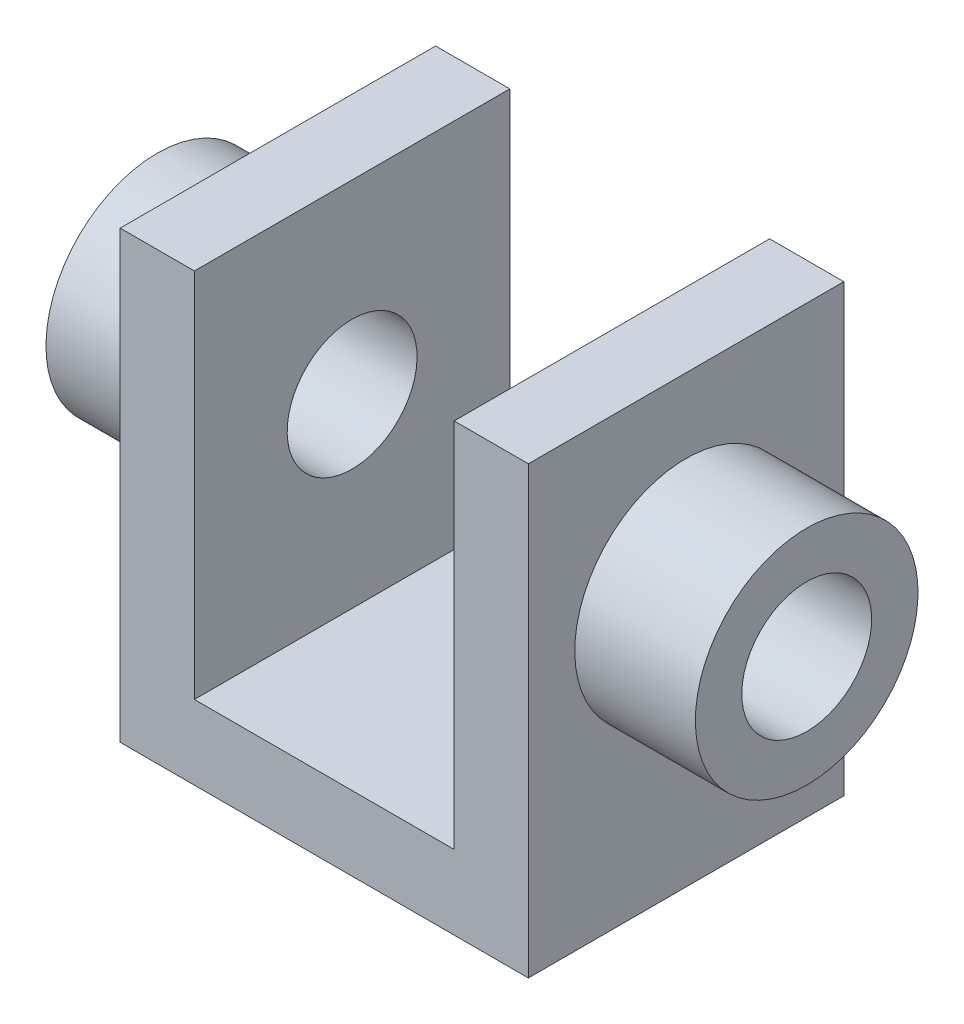
ISO-10303-21;
HEADER;
FILE_DESCRIPTION(('STEP AP214'),'2;1');
FILE_NAME('part.step','',(''),(''),'','','');
FILE_SCHEMA(('AUTOMOTIVE_DESIGN { 1 0 10303 214 1 1 1 1 }'));
ENDSEC;
DATA;
#1=APPLICATION_CONTEXT('core data for automotive mechanical design processes');
#2=APPLICATION_PROTOCOL_DEFINITION('international standard','automotive_design',2000,#1);
#3=PRODUCT_CONTEXT('',#1,'mechanical');
#4=PRODUCT('Part','Part','',(#3));
#5=PRODUCT_RELATED_PRODUCT_CATEGORY('part','',(#4));
#6=PRODUCT_DEFINITION_FORMATION('','',#4);
#7=PRODUCT_DEFINITION_CONTEXT('part definition',#1,'design');
#8=PRODUCT_DEFINITION('design','',#6,#7);
#9=PRODUCT_DEFINITION_SHAPE('','',#8);
#10=(LENGTH_UNIT() NAMED_UNIT(*) SI_UNIT(.MILLI.,.METRE.));
#11=(NAMED_UNIT(*) PLANE_ANGLE_UNIT() SI_UNIT($,.RADIAN.));
#12=(NAMED_UNIT(*) SI_UNIT($,.STERADIAN.) SOLID_ANGLE_UNIT());
#13=UNCERTAINTY_MEASURE_WITH_UNIT(LENGTH_MEASURE(1.E-05),#10,'distance_accuracy_value','');
#14=(GEOMETRIC_REPRESENTATION_CONTEXT(3) GLOBAL_UNCERTAINTY_ASSIGNED_CONTEXT((#13)) GLOBAL_UNIT_ASSIGNED_CONTEXT((#10,
#11,#12)) REPRESENTATION_CONTEXT('',''));
#15=CARTESIAN_POINT('',(0.,0.,0.));
#16=DIRECTION('',(0.,0.,1.));
#17=DIRECTION('',(1.,0.,0.));
#18=AXIS2_PLACEMENT_3D('',#15,#16,#17);
#19=CARTESIAN_POINT('',(0.,48.,-34.));
#20=DIRECTION('',(-1.,0.,0.));
#21=DIRECTION('',(0.,-1.,0.));
#22=AXIS2_PLACEMENT_3D('',#19,#20,#21);
#23=PLANE('',#22);
#24=CARTESIAN_POINT('',(0.,28.,-17.));
#25=DIRECTION('',(-1.,0.,0.));
#26=DIRECTION('',(0.,-1.,0.));
#27=AXIS2_PLACEMENT_3D('',#24,#25,#26);
#28=CIRCLE('',#27,12.);
#29=CARTESIAN_POINT('',(0.,40.,-17.));
#30=VERTEX_POINT('',#29);
#31=EDGE_CURVE('E41',#30,#30,#28,.T.);
#32=ORIENTED_EDGE('',*,*,#31,.F.);
#33=EDGE_LOOP('',(#32));
#34=FACE_BOUND('',#33,.T.);
#35=DIRECTION('',(0.,-1.,0.));
#36=VECTOR('',#35,1.);
#37=CARTESIAN_POINT('',(0.,48.,0.));
#38=LINE('',#37,#36);
#39=CARTESIAN_POINT('',(0.,48.,0.));
#40=VERTEX_POINT('',#39);
#41=CARTESIAN_POINT('',(0.,0.,0.));
#42=VERTEX_POINT('',#41);
#43=EDGE_CURVE('E132',#40,#42,#38,.T.);
#44=ORIENTED_EDGE('',*,*,#43,.F.);
#45=DIRECTION('',(0.,0.,1.));
#46=VECTOR('',#45,1.);
#47=CARTESIAN_POINT('',(0.,48.,-34.));
#48=LINE('',#47,#46);
#49=CARTESIAN_POINT('',(0.,48.,-34.));
#50=VERTEX_POINT('',#49);
#51=EDGE_CURVE('E49',#50,#40,#48,.T.);
#52=ORIENTED_EDGE('',*,*,#51,.F.);
#53=DIRECTION('',(0.,-1.,0.));
#54=VECTOR('',#53,1.);
#55=CARTESIAN_POINT('',(0.,48.,-34.));
#56=LINE('',#55,#54);
#57=CARTESIAN_POINT('',(0.,0.,-34.));
#58=VERTEX_POINT('',#57);
#59=EDGE_CURVE('E154',#50,#58,#56,.T.);
#60=ORIENTED_EDGE('',*,*,#59,.T.);
#61=DIRECTION('',(0.,0.,1.));
#62=VECTOR('',#61,1.);
#63=CARTESIAN_POINT('',(0.,0.,-34.));
#64=LINE('',#63,#62);
#65=EDGE_CURVE('E90',#58,#42,#64,.T.);
#66=ORIENTED_EDGE('',*,*,#65,.T.);
#67=EDGE_LOOP('',(#44,#52,#60,#66));
#68=FACE_BOUND('',#67,.T.);
#69=ADVANCED_FACE('F33',(#34,#68),#23,.T.);
#70=CARTESIAN_POINT('',(8.,48.,-34.));
#71=DIRECTION('',(0.,1.,0.));
#72=DIRECTION('',(0.,0.,1.));
#73=AXIS2_PLACEMENT_3D('',#70,#71,#72);
#74=PLANE('',#73);
#75=DIRECTION('',(-1.,0.,0.));
#76=VECTOR('',#75,1.);
#77=CARTESIAN_POINT('',(8.,48.,0.));
#78=LINE('',#77,#76);
#79=CARTESIAN_POINT('',(8.,48.,0.));
#80=VERTEX_POINT('',#79);
#81=EDGE_CURVE('E151',#80,#40,#78,.T.);
#82=ORIENTED_EDGE('',*,*,#81,.F.);
#83=DIRECTION('',(0.,0.,1.));
#84=VECTOR('',#83,1.);
#85=CARTESIAN_POINT('',(8.,48.,-34.));
#86=LINE('',#85,#84);
#87=CARTESIAN_POINT('',(8.,48.,-34.));
#88=VERTEX_POINT('',#87);
#89=EDGE_CURVE('E78',#88,#80,#86,.T.);
#90=ORIENTED_EDGE('',*,*,#89,.F.);
#91=DIRECTION('',(-1.,0.,0.));
#92=VECTOR('',#91,1.);
#93=CARTESIAN_POINT('',(8.,48.,-34.));
#94=LINE('',#93,#92);
#95=EDGE_CURVE('E122',#88,#50,#94,.T.);
#96=ORIENTED_EDGE('',*,*,#95,.T.);
#97=ORIENTED_EDGE('',*,*,#51,.T.);
#98=EDGE_LOOP('',(#82,#90,#96,#97));
#99=FACE_BOUND('',#98,.T.);
#100=ADVANCED_FACE('F167',(#99),#74,.T.);
#101=CARTESIAN_POINT('',(8.,8.,-34.));
#102=DIRECTION('',(1.,0.,0.));
#103=DIRECTION('',(0.,0.,-1.));
#104=AXIS2_PLACEMENT_3D('',#101,#102,#103);
#105=PLANE('',#104);
#106=CARTESIAN_POINT('',(8.,28.,-17.));
#107=DIRECTION('',(-1.,0.,0.));
#108=DIRECTION('',(0.,-1.,0.));
#109=AXIS2_PLACEMENT_3D('',#106,#107,#108);
#110=CIRCLE('',#109,7.);
#111=CARTESIAN_POINT('',(8.,35.,-17.));
#112=VERTEX_POINT('',#111);
#113=EDGE_CURVE('E233',#112,#112,#110,.T.);
#114=ORIENTED_EDGE('',*,*,#113,.T.);
#115=EDGE_LOOP('',(#114));
#116=FACE_BOUND('',#115,.T.);
#117=DIRECTION('',(0.,1.,0.));
#118=VECTOR('',#117,1.);
#119=CARTESIAN_POINT('',(8.,8.,0.));
#120=LINE('',#119,#118);
#121=CARTESIAN_POINT('',(8.,8.,0.));
#122=VERTEX_POINT('',#121);
#123=EDGE_CURVE('E109',#122,#80,#120,.T.);
#124=ORIENTED_EDGE('',*,*,#123,.F.);
#125=DIRECTION('',(0.,0.,1.));
#126=VECTOR('',#125,1.);
#127=CARTESIAN_POINT('',(8.,8.,-34.));
#128=LINE('',#127,#126);
#129=CARTESIAN_POINT('',(8.,8.,-34.));
#130=VERTEX_POINT('',#129);
#131=EDGE_CURVE('E104',#130,#122,#128,.T.);
#132=ORIENTED_EDGE('',*,*,#131,.F.);
#133=DIRECTION('',(0.,1.,0.));
#134=VECTOR('',#133,1.);
#135=CARTESIAN_POINT('',(8.,8.,-34.));
#136=LINE('',#135,#134);
#137=EDGE_CURVE('E107',#130,#88,#136,.T.);
#138=ORIENTED_EDGE('',*,*,#137,.T.);
#139=ORIENTED_EDGE('',*,*,#89,.T.);
#140=EDGE_LOOP('',(#124,#132,#138,#139));
#141=FACE_BOUND('',#140,.T.);
#142=ADVANCED_FACE('F106',(#116,#141),#105,.T.);
#143=CARTESIAN_POINT('',(36.,8.,-34.));
#144=DIRECTION('',(0.,1.,0.));
#145=DIRECTION('',(-1.,0.,0.));
#146=AXIS2_PLACEMENT_3D('',#143,#144,#145);
#147=PLANE('',#146);
#148=DIRECTION('',(-1.,0.,0.));
#149=VECTOR('',#148,1.);
#150=CARTESIAN_POINT('',(36.,8.,0.));
#151=LINE('',#150,#149);
#152=CARTESIAN_POINT('',(36.,8.,0.));
#153=VERTEX_POINT('',#152);
#154=EDGE_CURVE('E148',#153,#122,#151,.T.);
#155=ORIENTED_EDGE('',*,*,#154,.F.);
#156=DIRECTION('',(0.,0.,1.));
#157=VECTOR('',#156,1.);
#158=CARTESIAN_POINT('',(36.,8.,-34.));
#159=LINE('',#158,#157);
#160=CARTESIAN_POINT('',(36.,8.,-34.));
#161=VERTEX_POINT('',#160);
#162=EDGE_CURVE('E114',#161,#153,#159,.T.);
#163=ORIENTED_EDGE('',*,*,#162,.F.);
#164=DIRECTION('',(-1.,0.,0.));
#165=VECTOR('',#164,1.);
#166=CARTESIAN_POINT('',(36.,8.,-34.));
#167=LINE('',#166,#165);
#168=EDGE_CURVE('E120',#161,#130,#167,.T.);
#169=ORIENTED_EDGE('',*,*,#168,.T.);
#170=ORIENTED_EDGE('',*,*,#131,.T.);
#171=EDGE_LOOP('',(#155,#163,#169,#170));
#172=FACE_BOUND('',#171,.T.);
#173=ADVANCED_FACE('F124',(#172),#147,.T.);
#174=CARTESIAN_POINT('',(36.,48.,-34.));
#175=DIRECTION('',(-1.,0.,0.));
#176=DIRECTION('',(0.,-1.,0.));
#177=AXIS2_PLACEMENT_3D('',#174,#175,#176);
#178=PLANE('',#177);
#179=CARTESIAN_POINT('',(36.,28.,-17.));
#180=DIRECTION('',(1.,0.,0.));
#181=DIRECTION('',(0.,0.,-1.));
#182=AXIS2_PLACEMENT_3D('',#179,#180,#181);
#183=CIRCLE('',#182,7.);
#184=CARTESIAN_POINT('',(36.,21.,-17.));
#185=VERTEX_POINT('',#184);
#186=EDGE_CURVE('E232',#185,#185,#183,.T.);
#187=ORIENTED_EDGE('',*,*,#186,.T.);
#188=EDGE_LOOP('',(#187));
#189=FACE_BOUND('',#188,.T.);
#190=DIRECTION('',(0.,-1.,0.));
#191=VECTOR('',#190,1.);
#192=CARTESIAN_POINT('',(36.,48.,0.));
#193=LINE('',#192,#191);
#194=CARTESIAN_POINT('',(36.,48.,0.));
#195=VERTEX_POINT('',#194);
#196=EDGE_CURVE('E145',#195,#153,#193,.T.);
#197=ORIENTED_EDGE('',*,*,#196,.F.);
#198=DIRECTION('',(0.,0.,1.));
#199=VECTOR('',#198,1.);
#200=CARTESIAN_POINT('',(36.,48.,-34.));
#201=LINE('',#200,#199);
#202=CARTESIAN_POINT('',(36.,48.,-34.));
#203=VERTEX_POINT('',#202);
#204=EDGE_CURVE('E158',#203,#195,#201,.T.);
#205=ORIENTED_EDGE('',*,*,#204,.F.);
#206=DIRECTION('',(0.,-1.,0.));
#207=VECTOR('',#206,1.);
#208=CARTESIAN_POINT('',(36.,48.,-34.));
#209=LINE('',#208,#207);
#210=EDGE_CURVE('E125',#203,#161,#209,.T.);
#211=ORIENTED_EDGE('',*,*,#210,.T.);
#212=ORIENTED_EDGE('',*,*,#162,.T.);
#213=EDGE_LOOP('',(#197,#205,#211,#212));
#214=FACE_BOUND('',#213,.T.);
#215=ADVANCED_FACE('F182',(#189,#214),#178,.T.);
#216=CARTESIAN_POINT('',(44.,48.,-34.));
#217=DIRECTION('',(0.,1.,0.));
#218=DIRECTION('',(0.,0.,1.));
#219=AXIS2_PLACEMENT_3D('',#216,#217,#218);
#220=PLANE('',#219);
#221=DIRECTION('',(-1.,0.,0.));
#222=VECTOR('',#221,1.);
#223=CARTESIAN_POINT('',(44.,48.,0.));
#224=LINE('',#223,#222);
#225=CARTESIAN_POINT('',(44.,48.,0.));
#226=VERTEX_POINT('',#225);
#227=EDGE_CURVE('E142',#226,#195,#224,.T.);
#228=ORIENTED_EDGE('',*,*,#227,.F.);
#229=DIRECTION('',(0.,0.,1.));
#230=VECTOR('',#229,1.);
#231=CARTESIAN_POINT('',(44.,48.,-34.));
#232=LINE('',#231,#230);
#233=CARTESIAN_POINT('',(44.,48.,-34.));
#234=VERTEX_POINT('',#233);
#235=EDGE_CURVE('E160',#234,#226,#232,.T.);
#236=ORIENTED_EDGE('',*,*,#235,.F.);
#237=DIRECTION('',(-1.,0.,0.));
#238=VECTOR('',#237,1.);
#239=CARTESIAN_POINT('',(44.,48.,-34.));
#240=LINE('',#239,#238);
#241=EDGE_CURVE('E127',#234,#203,#240,.T.);
#242=ORIENTED_EDGE('',*,*,#241,.T.);
#243=ORIENTED_EDGE('',*,*,#204,.T.);
#244=EDGE_LOOP('',(#228,#236,#242,#243));
#245=FACE_BOUND('',#244,.T.);
#246=ADVANCED_FACE('F185',(#245),#220,.T.);
#247=CARTESIAN_POINT('',(44.,0.,-34.));
#248=DIRECTION('',(1.,0.,0.));
#249=DIRECTION('',(0.,0.,-1.));
#250=AXIS2_PLACEMENT_3D('',#247,#248,#249);
#251=PLANE('',#250);
#252=CARTESIAN_POINT('',(44.,28.,-17.));
#253=DIRECTION('',(1.,0.,0.));
#254=DIRECTION('',(0.,0.,-1.));
#255=AXIS2_PLACEMENT_3D('',#252,#253,#254);
#256=CIRCLE('',#255,12.);
#257=CARTESIAN_POINT('',(44.,16.,-17.));
#258=VERTEX_POINT('',#257);
#259=EDGE_CURVE('E11',#258,#258,#256,.T.);
#260=ORIENTED_EDGE('',*,*,#259,.F.);
#261=EDGE_LOOP('',(#260));
#262=FACE_BOUND('',#261,.T.);
#263=DIRECTION('',(0.,1.,0.));
#264=VECTOR('',#263,1.);
#265=CARTESIAN_POINT('',(44.,0.,0.));
#266=LINE('',#265,#264);
#267=CARTESIAN_POINT('',(44.,0.,0.));
#268=VERTEX_POINT('',#267);
#269=EDGE_CURVE('E139',#268,#226,#266,.T.);
#270=ORIENTED_EDGE('',*,*,#269,.F.);
#271=DIRECTION('',(0.,0.,1.));
#272=VECTOR('',#271,1.);
#273=CARTESIAN_POINT('',(44.,0.,-34.));
#274=LINE('',#273,#272);
#275=CARTESIAN_POINT('',(44.,0.,-34.));
#276=VERTEX_POINT('',#275);
#277=EDGE_CURVE('E162',#276,#268,#274,.T.);
#278=ORIENTED_EDGE('',*,*,#277,.F.);
#279=DIRECTION('',(0.,1.,0.));
#280=VECTOR('',#279,1.);
#281=CARTESIAN_POINT('',(44.,0.,-34.));
#282=LINE('',#281,#280);
#283=EDGE_CURVE('E252',#276,#234,#282,.T.);
#284=ORIENTED_EDGE('',*,*,#283,.T.);
#285=ORIENTED_EDGE('',*,*,#235,.T.);
#286=EDGE_LOOP('',(#270,#278,#284,#285));
#287=FACE_BOUND('',#286,.T.);
#288=ADVANCED_FACE('F189',(#262,#287),#251,.T.);
#289=CARTESIAN_POINT('',(0.,0.,-34.));
#290=DIRECTION('',(0.,-1.,0.));
#291=DIRECTION('',(0.,0.,-1.));
#292=AXIS2_PLACEMENT_3D('',#289,#290,#291);
#293=PLANE('',#292);
#294=DIRECTION('',(1.,0.,0.));
#295=VECTOR('',#294,1.);
#296=CARTESIAN_POINT('',(0.,0.,0.));
#297=LINE('',#296,#295);
#298=EDGE_CURVE('E135',#42,#268,#297,.T.);
#299=ORIENTED_EDGE('',*,*,#298,.F.);
#300=ORIENTED_EDGE('',*,*,#65,.F.);
#301=DIRECTION('',(1.,0.,0.));
#302=VECTOR('',#301,1.);
#303=CARTESIAN_POINT('',(0.,0.,-34.));
#304=LINE('',#303,#302);
#305=EDGE_CURVE('E250',#58,#276,#304,.T.);
#306=ORIENTED_EDGE('',*,*,#305,.T.);
#307=ORIENTED_EDGE('',*,*,#277,.T.);
#308=EDGE_LOOP('',(#299,#300,#306,#307));
#309=FACE_BOUND('',#308,.T.);
#310=ADVANCED_FACE('F163',(#309),#293,.T.);
#311=CARTESIAN_POINT('',(0.,0.,-34.));
#312=DIRECTION('',(0.,0.,1.));
#313=DIRECTION('',(1.,0.,0.));
#314=AXIS2_PLACEMENT_3D('',#311,#312,#313);
#315=PLANE('',#314);
#316=ORIENTED_EDGE('',*,*,#59,.F.);
#317=ORIENTED_EDGE('',*,*,#95,.F.);
#318=ORIENTED_EDGE('',*,*,#137,.F.);
#319=ORIENTED_EDGE('',*,*,#168,.F.);
#320=ORIENTED_EDGE('',*,*,#210,.F.);
#321=ORIENTED_EDGE('',*,*,#241,.F.);
#322=ORIENTED_EDGE('',*,*,#283,.F.);
#323=ORIENTED_EDGE('',*,*,#305,.F.);
#324=EDGE_LOOP('',(#316,#317,#318,#319,#320,#321,#322,#323));
#325=FACE_BOUND('',#324,.T.);
#326=ADVANCED_FACE('F118',(#325),#315,.F.);
#327=CARTESIAN_POINT('',(0.,0.,0.));
#328=DIRECTION('',(0.,0.,1.));
#329=DIRECTION('',(1.,0.,0.));
#330=AXIS2_PLACEMENT_3D('',#327,#328,#329);
#331=PLANE('',#330);
#332=ORIENTED_EDGE('',*,*,#43,.T.);
#333=ORIENTED_EDGE('',*,*,#298,.T.);
#334=ORIENTED_EDGE('',*,*,#269,.T.);
#335=ORIENTED_EDGE('',*,*,#227,.T.);
#336=ORIENTED_EDGE('',*,*,#196,.T.);
#337=ORIENTED_EDGE('',*,*,#154,.T.);
#338=ORIENTED_EDGE('',*,*,#123,.T.);
#339=ORIENTED_EDGE('',*,*,#81,.T.);
#340=EDGE_LOOP('',(#332,#333,#334,#335,#336,#337,#338,#339));
#341=FACE_BOUND('',#340,.T.);
#342=ADVANCED_FACE('F166',(#341),#331,.T.);
#343=CARTESIAN_POINT('',(-13.,28.,-17.));
#344=DIRECTION('',(-1.,0.,0.));
#345=DIRECTION('',(0.,-1.,0.));
#346=AXIS2_PLACEMENT_3D('',#343,#344,#345);
#347=PLANE('',#346);
#348=CARTESIAN_POINT('',(-13.,28.,-17.));
#349=DIRECTION('',(-1.,0.,0.));
#350=DIRECTION('',(0.,-1.,0.));
#351=AXIS2_PLACEMENT_3D('',#348,#349,#350);
#352=CIRCLE('',#351,12.);
#353=CARTESIAN_POINT('',(-13.,40.,-17.));
#354=VERTEX_POINT('',#353);
#355=EDGE_CURVE('E136',#354,#354,#352,.T.);
#356=ORIENTED_EDGE('',*,*,#355,.T.);
#357=EDGE_LOOP('',(#356));
#358=FACE_BOUND('',#357,.T.);
#359=CARTESIAN_POINT('',(-13.,28.,-17.));
#360=DIRECTION('',(-1.,0.,0.));
#361=DIRECTION('',(0.,-1.,0.));
#362=AXIS2_PLACEMENT_3D('',#359,#360,#361);
#363=CIRCLE('',#362,7.);
#364=CARTESIAN_POINT('',(-13.,35.,-17.));
#365=VERTEX_POINT('',#364);
#366=EDGE_CURVE('E242',#365,#365,#363,.T.);
#367=ORIENTED_EDGE('',*,*,#366,.F.);
#368=EDGE_LOOP('',(#367));
#369=FACE_BOUND('',#368,.T.);
#370=ADVANCED_FACE('F200',(#358,#369),#347,.T.);
#371=CARTESIAN_POINT('',(-13.,28.,-17.));
#372=DIRECTION('',(1.,0.,0.));
#373=DIRECTION('',(0.,1.,0.));
#374=AXIS2_PLACEMENT_3D('',#371,#372,#373);
#375=CYLINDRICAL_SURFACE('',#374,12.);
#376=CARTESIAN_POINT('',(-13.,40.,-17.));
#377=CARTESIAN_POINT('',(-12.8645833333333,40.,-17.));
#378=CARTESIAN_POINT('',(-12.7291666666667,40.,-17.));
#379=CARTESIAN_POINT('',(-12.4583333333333,40.,-17.));
#380=CARTESIAN_POINT('',(-12.3229166666667,40.,-17.));
#381=CARTESIAN_POINT('',(-12.0520833333333,40.,-17.));
#382=CARTESIAN_POINT('',(-11.9166666666667,40.,-17.));
#383=CARTESIAN_POINT('',(-11.6458333333333,40.,-17.));
#384=CARTESIAN_POINT('',(-11.5104166666667,40.,-17.));
#385=CARTESIAN_POINT('',(-11.2395833333333,40.,-17.));
#386=CARTESIAN_POINT('',(-11.1041666666667,40.,-17.));
#387=CARTESIAN_POINT('',(-10.8333333333333,40.,-17.));
#388=CARTESIAN_POINT('',(-10.6979166666667,40.,-17.));
#389=CARTESIAN_POINT('',(-10.4270833333333,40.,-17.));
#390=CARTESIAN_POINT('',(-10.2916666666667,40.,-17.));
#391=CARTESIAN_POINT('',(-10.0208333333333,40.,-17.));
#392=CARTESIAN_POINT('',(-9.88541666666667,40.,-17.));
#393=CARTESIAN_POINT('',(-9.61458333333333,40.,-17.));
#394=CARTESIAN_POINT('',(-9.47916666666667,40.,-17.));
#395=CARTESIAN_POINT('',(-9.20833333333333,40.,-17.));
#396=CARTESIAN_POINT('',(-9.07291666666667,40.,-17.));
#397=CARTESIAN_POINT('',(-8.80208333333333,40.,-17.));
#398=CARTESIAN_POINT('',(-8.66666666666667,40.,-17.));
#399=CARTESIAN_POINT('',(-8.39583333333333,40.,-17.));
#400=CARTESIAN_POINT('',(-8.26041666666667,40.,-17.));
#401=CARTESIAN_POINT('',(-7.98958333333333,40.,-17.));
#402=CARTESIAN_POINT('',(-7.85416666666667,40.,-17.));
#403=CARTESIAN_POINT('',(-7.58333333333333,40.,-17.));
#404=CARTESIAN_POINT('',(-7.44791666666667,40.,-17.));
#405=CARTESIAN_POINT('',(-7.17708333333333,40.,-17.));
#406=CARTESIAN_POINT('',(-7.04166666666667,40.,-17.));
#407=CARTESIAN_POINT('',(-6.77083333333333,40.,-17.));
#408=CARTESIAN_POINT('',(-6.63541666666667,40.,-17.));
#409=CARTESIAN_POINT('',(-6.36458333333333,40.,-17.));
#410=CARTESIAN_POINT('',(-6.22916666666667,40.,-17.));
#411=CARTESIAN_POINT('',(-5.95833333333333,40.,-17.));
#412=CARTESIAN_POINT('',(-5.82291666666667,40.,-17.));
#413=CARTESIAN_POINT('',(-5.55208333333333,40.,-17.));
#414=CARTESIAN_POINT('',(-5.41666666666667,40.,-17.));
#415=CARTESIAN_POINT('',(-5.14583333333333,40.,-17.));
#416=CARTESIAN_POINT('',(-5.01041666666667,40.,-17.));
#417=CARTESIAN_POINT('',(-4.73958333333333,40.,-17.));
#418=CARTESIAN_POINT('',(-4.60416666666667,40.,-17.));
#419=CARTESIAN_POINT('',(-4.33333333333333,40.,-17.));
#420=CARTESIAN_POINT('',(-4.19791666666667,40.,-17.));
#421=CARTESIAN_POINT('',(-3.92708333333333,40.,-17.));
#422=CARTESIAN_POINT('',(-3.79166666666667,40.,-17.));
#423=CARTESIAN_POINT('',(-3.52083333333333,40.,-17.));
#424=CARTESIAN_POINT('',(-3.38541666666667,40.,-17.));
#425=CARTESIAN_POINT('',(-3.11458333333333,40.,-17.));
#426=CARTESIAN_POINT('',(-2.97916666666667,40.,-17.));
#427=CARTESIAN_POINT('',(-2.70833333333333,40.,-17.));
#428=CARTESIAN_POINT('',(-2.57291666666667,40.,-17.));
#429=CARTESIAN_POINT('',(-2.30208333333333,40.,-17.));
#430=CARTESIAN_POINT('',(-2.16666666666667,40.,-17.));
#431=CARTESIAN_POINT('',(-1.89583333333333,40.,-17.));
#432=CARTESIAN_POINT('',(-1.76041666666667,40.,-17.));
#433=CARTESIAN_POINT('',(-1.48958333333333,40.,-17.));
#434=CARTESIAN_POINT('',(-1.35416666666667,40.,-17.));
#435=CARTESIAN_POINT('',(-1.08333333333333,40.,-17.));
#436=CARTESIAN_POINT('',(-0.947916666666667,40.,-17.));
#437=CARTESIAN_POINT('',(-0.677083333333334,40.,-17.));
#438=CARTESIAN_POINT('',(-0.541666666666667,40.,-17.));
#439=CARTESIAN_POINT('',(-0.270833333333334,40.,-17.));
#440=CARTESIAN_POINT('',(-0.135416666666667,40.,-17.));
#441=CARTESIAN_POINT('',(0.,40.,-17.));
#442=B_SPLINE_CURVE_WITH_KNOTS('',3,(#376,#377,#378,#379,#380,#381,#382,#383,#384,#385,#386,
#387,#388,#389,#390,#391,#392,#393,#394,#395,#396,#397,#398,#399,#400,#401,#402,#403,#404,#405,
#406,#407,#408,#409,#410,#411,#412,#413,#414,#415,#416,#417,#418,#419,#420,#421,#422,#423,#424,
#425,#426,#427,#428,#429,#430,#431,#432,#433,#434,#435,#436,#437,#438,#439,#440,#441),
.UNSPECIFIED.,.F.,.F.,(4,2,2,2,2,2,2,2,2,2,2,2,2,2,2,2,2,2,2,2,2,2,2,2,2,2,2,2,2,2,2,2,4),(0.,
0.406249999999999,0.812499999999999,1.21875,1.625,2.03125,2.4375,2.84375,3.25,3.65625,4.0625,
4.46875,4.875,5.28125,5.6875,6.09375,6.5,6.90625,7.3125,7.71875,8.125,8.53125,8.9375,9.34375,
9.75,10.15625,10.5625,10.96875,11.375,11.78125,12.1875,12.59375,13.),.UNSPECIFIED.);
#443=EDGE_CURVE('BSEAM202',#354,#30,#442,.T.);
#444=ORIENTED_EDGE('',*,*,#355,.F.);
#445=ORIENTED_EDGE('',*,*,#31,.T.);
#446=ORIENTED_EDGE('',*,*,#443,.T.);
#447=ORIENTED_EDGE('',*,*,#443,.F.);
#448=EDGE_LOOP('',(#444,#446,#445,#447));
#449=FACE_BOUND('',#448,.T.);
#450=ADVANCED_FACE('F202',(#449),#375,.T.);
#451=CARTESIAN_POINT('',(-13.,28.,-17.));
#452=DIRECTION('',(1.,0.,0.));
#453=DIRECTION('',(0.,1.,0.));
#454=AXIS2_PLACEMENT_3D('',#451,#452,#453);
#455=CYLINDRICAL_SURFACE('',#454,7.);
#456=CARTESIAN_POINT('',(-13.,35.,-17.));
#457=CARTESIAN_POINT('',(-12.78125,35.,-17.));
#458=CARTESIAN_POINT('',(-12.5625,35.,-17.));
#459=CARTESIAN_POINT('',(-12.125,35.,-17.));
#460=CARTESIAN_POINT('',(-11.90625,35.,-17.));
#461=CARTESIAN_POINT('',(-11.46875,35.,-17.));
#462=CARTESIAN_POINT('',(-11.25,35.,-17.));
#463=CARTESIAN_POINT('',(-10.8125,35.,-17.));
#464=CARTESIAN_POINT('',(-10.59375,35.,-17.));
#465=CARTESIAN_POINT('',(-10.15625,35.,-17.));
#466=CARTESIAN_POINT('',(-9.9375,35.,-17.));
#467=CARTESIAN_POINT('',(-9.5,35.,-17.));
#468=CARTESIAN_POINT('',(-9.28125,35.,-17.));
#469=CARTESIAN_POINT('',(-8.84375,35.,-17.));
#470=CARTESIAN_POINT('',(-8.625,35.,-17.));
#471=CARTESIAN_POINT('',(-8.1875,35.,-17.));
#472=CARTESIAN_POINT('',(-7.96875,35.,-17.));
#473=CARTESIAN_POINT('',(-7.53125,35.,-17.));
#474=CARTESIAN_POINT('',(-7.3125,35.,-17.));
#475=CARTESIAN_POINT('',(-6.875,35.,-17.));
#476=CARTESIAN_POINT('',(-6.65625,35.,-17.));
#477=CARTESIAN_POINT('',(-6.21875,35.,-17.));
#478=CARTESIAN_POINT('',(-6.,35.,-17.));
#479=CARTESIAN_POINT('',(-5.5625,35.,-17.));
#480=CARTESIAN_POINT('',(-5.34375,35.,-17.));
#481=CARTESIAN_POINT('',(-4.90625,35.,-17.));
#482=CARTESIAN_POINT('',(-4.6875,35.,-17.));
#483=CARTESIAN_POINT('',(-4.25,35.,-17.));
#484=CARTESIAN_POINT('',(-4.03125,35.,-17.));
#485=CARTESIAN_POINT('',(-3.59375,35.,-17.));
#486=CARTESIAN_POINT('',(-3.375,35.,-17.));
#487=CARTESIAN_POINT('',(-2.9375,35.,-17.));
#488=CARTESIAN_POINT('',(-2.71875,35.,-17.));
#489=CARTESIAN_POINT('',(-2.28125,35.,-17.));
#490=CARTESIAN_POINT('',(-2.0625,35.,-17.));
#491=CARTESIAN_POINT('',(-1.625,35.,-17.));
#492=CARTESIAN_POINT('',(-1.40625,35.,-17.));
#493=CARTESIAN_POINT('',(-0.96875,35.,-17.));
#494=CARTESIAN_POINT('',(-0.75,35.,-17.));
#495=CARTESIAN_POINT('',(-0.3125,35.,-17.));
#496=CARTESIAN_POINT('',(-0.0937500000000001,35.,-17.));
#497=CARTESIAN_POINT('',(0.34375,35.,-17.));
#498=CARTESIAN_POINT('',(0.5625,35.,-17.));
#499=CARTESIAN_POINT('',(1.,35.,-17.));
#500=CARTESIAN_POINT('',(1.21875,35.,-17.));
#501=CARTESIAN_POINT('',(1.65625,35.,-17.));
#502=CARTESIAN_POINT('',(1.875,35.,-17.));
#503=CARTESIAN_POINT('',(2.3125,35.,-17.));
#504=CARTESIAN_POINT('',(2.53125,35.,-17.));
#505=CARTESIAN_POINT('',(2.96875,35.,-17.));
#506=CARTESIAN_POINT('',(3.1875,35.,-17.));
#507=CARTESIAN_POINT('',(3.625,35.,-17.));
#508=CARTESIAN_POINT('',(3.84375,35.,-17.));
#509=CARTESIAN_POINT('',(4.28125,35.,-17.));
#510=CARTESIAN_POINT('',(4.5,35.,-17.));
#511=CARTESIAN_POINT('',(4.9375,35.,-17.));
#512=CARTESIAN_POINT('',(5.15625,35.,-17.));
#513=CARTESIAN_POINT('',(5.59375,35.,-17.));
#514=CARTESIAN_POINT('',(5.8125,35.,-17.));
#515=CARTESIAN_POINT('',(6.25,35.,-17.));
#516=CARTESIAN_POINT('',(6.46875,35.,-17.));
#517=CARTESIAN_POINT('',(6.90625,35.,-17.));
#518=CARTESIAN_POINT('',(7.125,35.,-17.));
#519=CARTESIAN_POINT('',(7.5625,35.,-17.));
#520=CARTESIAN_POINT('',(7.78125,35.,-17.));
#521=CARTESIAN_POINT('',(8.,35.,-17.));
#522=B_SPLINE_CURVE_WITH_KNOTS('',3,(#456,#457,#458,#459,#460,#461,#462,#463,#464,#465,#466,
#467,#468,#469,#470,#471,#472,#473,#474,#475,#476,#477,#478,#479,#480,#481,#482,#483,#484,#485,
#486,#487,#488,#489,#490,#491,#492,#493,#494,#495,#496,#497,#498,#499,#500,#501,#502,#503,#504,
#505,#506,#507,#508,#509,#510,#511,#512,#513,#514,#515,#516,#517,#518,#519,#520,#521),
.UNSPECIFIED.,.F.,.F.,(4,2,2,2,2,2,2,2,2,2,2,2,2,2,2,2,2,2,2,2,2,2,2,2,2,2,2,2,2,2,2,2,4),(0.,
0.656250000000001,1.3125,1.96875,2.625,3.28125,3.9375,4.59375,5.25,5.90625,6.5625,7.21875,7.875,
8.53125,9.1875,9.84375,10.5,11.15625,11.8125,12.46875,13.125,13.78125,14.4375,15.09375,15.75,
16.40625,17.0625,17.71875,18.375,19.03125,19.6875,20.34375,21.),.UNSPECIFIED.);
#523=EDGE_CURVE('BSEAM205',#365,#112,#522,.T.);
#524=ORIENTED_EDGE('',*,*,#366,.T.);
#525=ORIENTED_EDGE('',*,*,#113,.F.);
#526=ORIENTED_EDGE('',*,*,#523,.T.);
#527=ORIENTED_EDGE('',*,*,#523,.F.);
#528=EDGE_LOOP('',(#524,#526,#525,#527));
#529=FACE_BOUND('',#528,.T.);
#530=ADVANCED_FACE('F205',(#529),#455,.F.);
#531=CARTESIAN_POINT('',(57.,28.,-17.));
#532=DIRECTION('',(-1.,0.,0.));
#533=DIRECTION('',(0.,-1.,0.));
#534=AXIS2_PLACEMENT_3D('',#531,#532,#533);
#535=CYLINDRICAL_SURFACE('',#534,12.);
#536=CARTESIAN_POINT('',(57.,28.,-17.));
#537=DIRECTION('',(-1.,0.,0.));
#538=DIRECTION('',(0.,-1.,0.));
#539=AXIS2_PLACEMENT_3D('',#536,#537,#538);
#540=CIRCLE('',#539,12.);
#541=CARTESIAN_POINT('',(57.,16.,-17.));
#542=VERTEX_POINT('',#541);
#543=EDGE_CURVE('E235',#542,#542,#540,.T.);
#544=CARTESIAN_POINT('',(44.,16.,-17.));
#545=CARTESIAN_POINT('',(44.1354166666667,16.,-17.));
#546=CARTESIAN_POINT('',(44.2708333333333,16.,-17.));
#547=CARTESIAN_POINT('',(44.5416666666667,16.,-17.));
#548=CARTESIAN_POINT('',(44.6770833333333,16.,-17.));
#549=CARTESIAN_POINT('',(44.9479166666667,16.,-17.));
#550=CARTESIAN_POINT('',(45.0833333333333,16.,-17.));
#551=CARTESIAN_POINT('',(45.3541666666667,16.,-17.));
#552=CARTESIAN_POINT('',(45.4895833333333,16.,-17.));
#553=CARTESIAN_POINT('',(45.7604166666667,16.,-17.));
#554=CARTESIAN_POINT('',(45.8958333333333,16.,-17.));
#555=CARTESIAN_POINT('',(46.1666666666667,16.,-17.));
#556=CARTESIAN_POINT('',(46.3020833333333,16.,-17.));
#557=CARTESIAN_POINT('',(46.5729166666667,16.,-17.));
#558=CARTESIAN_POINT('',(46.7083333333333,16.,-17.));
#559=CARTESIAN_POINT('',(46.9791666666667,16.,-17.));
#560=CARTESIAN_POINT('',(47.1145833333333,16.,-17.));
#561=CARTESIAN_POINT('',(47.3854166666667,16.,-17.));
#562=CARTESIAN_POINT('',(47.5208333333333,16.,-17.));
#563=CARTESIAN_POINT('',(47.7916666666667,16.,-17.));
#564=CARTESIAN_POINT('',(47.9270833333333,16.,-17.));
#565=CARTESIAN_POINT('',(48.1979166666667,16.,-17.));
#566=CARTESIAN_POINT('',(48.3333333333333,16.,-17.));
#567=CARTESIAN_POINT('',(48.6041666666667,16.,-17.));
#568=CARTESIAN_POINT('',(48.7395833333333,16.,-17.));
#569=CARTESIAN_POINT('',(49.0104166666667,16.,-17.));
#570=CARTESIAN_POINT('',(49.1458333333333,16.,-17.));
#571=CARTESIAN_POINT('',(49.4166666666667,16.,-17.));
#572=CARTESIAN_POINT('',(49.5520833333333,16.,-17.));
#573=CARTESIAN_POINT('',(49.8229166666667,16.,-17.));
#574=CARTESIAN_POINT('',(49.9583333333333,16.,-17.));
#575=CARTESIAN_POINT('',(50.2291666666667,16.,-17.));
#576=CARTESIAN_POINT('',(50.3645833333333,16.,-17.));
#577=CARTESIAN_POINT('',(50.6354166666667,16.,-17.));
#578=CARTESIAN_POINT('',(50.7708333333333,16.,-17.));
#579=CARTESIAN_POINT('',(51.0416666666667,16.,-17.));
#580=CARTESIAN_POINT('',(51.1770833333333,16.,-17.));
#581=CARTESIAN_POINT('',(51.4479166666667,16.,-17.));
#582=CARTESIAN_POINT('',(51.5833333333333,16.,-17.));
#583=CARTESIAN_POINT('',(51.8541666666667,16.,-17.));
#584=CARTESIAN_POINT('',(51.9895833333333,16.,-17.));
#585=CARTESIAN_POINT('',(52.2604166666667,16.,-17.));
#586=CARTESIAN_POINT('',(52.3958333333333,16.,-17.));
#587=CARTESIAN_POINT('',(52.6666666666667,16.,-17.));
#588=CARTESIAN_POINT('',(52.8020833333333,16.,-17.));
#589=CARTESIAN_POINT('',(53.0729166666667,16.,-17.));
#590=CARTESIAN_POINT('',(53.2083333333333,16.,-17.));
#591=CARTESIAN_POINT('',(53.4791666666667,16.,-17.));
#592=CARTESIAN_POINT('',(53.6145833333333,16.,-17.));
#593=CARTESIAN_POINT('',(53.8854166666667,16.,-17.));
#594=CARTESIAN_POINT('',(54.0208333333333,16.,-17.));
#595=CARTESIAN_POINT('',(54.2916666666667,16.,-17.));
#596=CARTESIAN_POINT('',(54.4270833333333,16.,-17.));
#597=CARTESIAN_POINT('',(54.6979166666667,16.,-17.));
#598=CARTESIAN_POINT('',(54.8333333333333,16.,-17.));
#599=CARTESIAN_POINT('',(55.1041666666667,16.,-17.));
#600=CARTESIAN_POINT('',(55.2395833333333,16.,-17.));
#601=CARTESIAN_POINT('',(55.5104166666667,16.,-17.));
#602=CARTESIAN_POINT('',(55.6458333333333,16.,-17.));
#603=CARTESIAN_POINT('',(55.9166666666667,16.,-17.));
#604=CARTESIAN_POINT('',(56.0520833333333,16.,-17.));
#605=CARTESIAN_POINT('',(56.3229166666667,16.,-17.));
#606=CARTESIAN_POINT('',(56.4583333333333,16.,-17.));
#607=CARTESIAN_POINT('',(56.7291666666667,16.,-17.));
#608=CARTESIAN_POINT('',(56.8645833333333,16.,-17.));
#609=CARTESIAN_POINT('',(57.,16.,-17.));
#610=B_SPLINE_CURVE_WITH_KNOTS('',3,(#544,#545,#546,#547,#548,#549,#550,#551,#552,#553,#554,
#555,#556,#557,#558,#559,#560,#561,#562,#563,#564,#565,#566,#567,#568,#569,#570,#571,#572,#573,
#574,#575,#576,#577,#578,#579,#580,#581,#582,#583,#584,#585,#586,#587,#588,#589,#590,#591,#592,
#593,#594,#595,#596,#597,#598,#599,#600,#601,#602,#603,#604,#605,#606,#607,#608,#609),
.UNSPECIFIED.,.F.,.F.,(4,2,2,2,2,2,2,2,2,2,2,2,2,2,2,2,2,2,2,2,2,2,2,2,2,2,2,2,2,2,2,2,4),(0.,
0.406250000000004,0.812500000000001,1.21875,1.625,2.03125000000001,2.4375,2.84375000000001,3.25,
3.65625000000001,4.0625,4.46875000000001,4.875,5.28125,5.68750000000001,6.09375,
6.50000000000001,6.90625,7.31250000000001,7.71875,8.12500000000001,8.53125,8.93750000000001,
9.34375000000001,9.75000000000001,10.15625,10.5625,10.96875,11.375,11.78125,12.1875,12.59375,
13.),.UNSPECIFIED.);
#611=EDGE_CURVE('BSEAM212',#258,#542,#610,.T.);
#612=ORIENTED_EDGE('',*,*,#259,.T.);
#613=ORIENTED_EDGE('',*,*,#543,.T.);
#614=ORIENTED_EDGE('',*,*,#611,.T.);
#615=ORIENTED_EDGE('',*,*,#611,.F.);
#616=EDGE_LOOP('',(#612,#614,#613,#615));
#617=FACE_BOUND('',#616,.T.);
#618=ADVANCED_FACE('F212',(#617),#535,.T.);
#619=CARTESIAN_POINT('',(57.,28.,-17.));
#620=DIRECTION('',(-1.,0.,0.));
#621=DIRECTION('',(0.,-1.,0.));
#622=AXIS2_PLACEMENT_3D('',#619,#620,#621);
#623=PLANE('',#622);
#624=CARTESIAN_POINT('',(57.,28.,-17.));
#625=DIRECTION('',(-1.,0.,0.));
#626=DIRECTION('',(0.,-1.,0.));
#627=AXIS2_PLACEMENT_3D('',#624,#625,#626);
#628=CIRCLE('',#627,7.);
#629=CARTESIAN_POINT('',(57.,21.,-17.));
#630=VERTEX_POINT('',#629);
#631=EDGE_CURVE('E229',#630,#630,#628,.T.);
#632=ORIENTED_EDGE('',*,*,#631,.T.);
#633=EDGE_LOOP('',(#632));
#634=FACE_BOUND('',#633,.T.);
#635=ORIENTED_EDGE('',*,*,#543,.F.);
#636=EDGE_LOOP('',(#635));
#637=FACE_BOUND('',#636,.T.);
#638=ADVANCED_FACE('F216',(#634,#637),#623,.F.);
#639=CARTESIAN_POINT('',(57.,28.,-17.));
#640=DIRECTION('',(-1.,0.,0.));
#641=DIRECTION('',(0.,-1.,0.));
#642=AXIS2_PLACEMENT_3D('',#639,#640,#641);
#643=CYLINDRICAL_SURFACE('',#642,7.);
#644=CARTESIAN_POINT('',(57.,21.,-17.));
#645=CARTESIAN_POINT('',(56.78125,21.,-17.));
#646=CARTESIAN_POINT('',(56.5625,21.,-17.));
#647=CARTESIAN_POINT('',(56.125,21.,-17.));
#648=CARTESIAN_POINT('',(55.90625,21.,-17.));
#649=CARTESIAN_POINT('',(55.46875,21.,-17.));
#650=CARTESIAN_POINT('',(55.25,21.,-17.));
#651=CARTESIAN_POINT('',(54.8125,21.,-17.));
#652=CARTESIAN_POINT('',(54.59375,21.,-17.));
#653=CARTESIAN_POINT('',(54.15625,21.,-17.));
#654=CARTESIAN_POINT('',(53.9375,21.,-17.));
#655=CARTESIAN_POINT('',(53.5,21.,-17.));
#656=CARTESIAN_POINT('',(53.28125,21.,-17.));
#657=CARTESIAN_POINT('',(52.84375,21.,-17.));
#658=CARTESIAN_POINT('',(52.625,21.,-17.));
#659=CARTESIAN_POINT('',(52.1875,21.,-17.));
#660=CARTESIAN_POINT('',(51.96875,21.,-17.));
#661=CARTESIAN_POINT('',(51.53125,21.,-17.));
#662=CARTESIAN_POINT('',(51.3125,21.,-17.));
#663=CARTESIAN_POINT('',(50.875,21.,-17.));
#664=CARTESIAN_POINT('',(50.65625,21.,-17.));
#665=CARTESIAN_POINT('',(50.21875,21.,-17.));
#666=CARTESIAN_POINT('',(50.,21.,-17.));
#667=CARTESIAN_POINT('',(49.5625,21.,-17.));
#668=CARTESIAN_POINT('',(49.34375,21.,-17.));
#669=CARTESIAN_POINT('',(48.90625,21.,-17.));
#670=CARTESIAN_POINT('',(48.6875,21.,-17.));
#671=CARTESIAN_POINT('',(48.25,21.,-17.));
#672=CARTESIAN_POINT('',(48.03125,21.,-17.));
#673=CARTESIAN_POINT('',(47.59375,21.,-17.));
#674=CARTESIAN_POINT('',(47.375,21.,-17.));
#675=CARTESIAN_POINT('',(46.9375,21.,-17.));
#676=CARTESIAN_POINT('',(46.71875,21.,-17.));
#677=CARTESIAN_POINT('',(46.28125,21.,-17.));
#678=CARTESIAN_POINT('',(46.0625,21.,-17.));
#679=CARTESIAN_POINT('',(45.625,21.,-17.));
#680=CARTESIAN_POINT('',(45.40625,21.,-17.));
#681=CARTESIAN_POINT('',(44.96875,21.,-17.));
#682=CARTESIAN_POINT('',(44.75,21.,-17.));
#683=CARTESIAN_POINT('',(44.3125,21.,-17.));
#684=CARTESIAN_POINT('',(44.09375,21.,-17.));
#685=CARTESIAN_POINT('',(43.65625,21.,-17.));
#686=CARTESIAN_POINT('',(43.4375,21.,-17.));
#687=CARTESIAN_POINT('',(43.,21.,-17.));
#688=CARTESIAN_POINT('',(42.78125,21.,-17.));
#689=CARTESIAN_POINT('',(42.34375,21.,-17.));
#690=CARTESIAN_POINT('',(42.125,21.,-17.));
#691=CARTESIAN_POINT('',(41.6875,21.,-17.));
#692=CARTESIAN_POINT('',(41.46875,21.,-17.));
#693=CARTESIAN_POINT('',(41.03125,21.,-17.));
#694=CARTESIAN_POINT('',(40.8125,21.,-17.));
#695=CARTESIAN_POINT('',(40.375,21.,-17.));
#696=CARTESIAN_POINT('',(40.15625,21.,-17.));
#697=CARTESIAN_POINT('',(39.71875,21.,-17.));
#698=CARTESIAN_POINT('',(39.5,21.,-17.));
#699=CARTESIAN_POINT('',(39.0625,21.,-17.));
#700=CARTESIAN_POINT('',(38.84375,21.,-17.));
#701=CARTESIAN_POINT('',(38.40625,21.,-17.));
#702=CARTESIAN_POINT('',(38.1875,21.,-17.));
#703=CARTESIAN_POINT('',(37.75,21.,-17.));
#704=CARTESIAN_POINT('',(37.53125,21.,-17.));
#705=CARTESIAN_POINT('',(37.09375,21.,-17.));
#706=CARTESIAN_POINT('',(36.875,21.,-17.));
#707=CARTESIAN_POINT('',(36.4375,21.,-17.));
#708=CARTESIAN_POINT('',(36.21875,21.,-17.));
#709=CARTESIAN_POINT('',(36.,21.,-17.));
#710=B_SPLINE_CURVE_WITH_KNOTS('',3,(#644,#645,#646,#647,#648,#649,#650,#651,#652,#653,#654,
#655,#656,#657,#658,#659,#660,#661,#662,#663,#664,#665,#666,#667,#668,#669,#670,#671,#672,#673,
#674,#675,#676,#677,#678,#679,#680,#681,#682,#683,#684,#685,#686,#687,#688,#689,#690,#691,#692,
#693,#694,#695,#696,#697,#698,#699,#700,#701,#702,#703,#704,#705,#706,#707,#708,#709),
.UNSPECIFIED.,.F.,.F.,(4,2,2,2,2,2,2,2,2,2,2,2,2,2,2,2,2,2,2,2,2,2,2,2,2,2,2,2,2,2,2,2,4),(0.,
0.656250000000004,1.3125,1.96875000000001,2.625,3.28125000000001,3.9375,4.59375,5.25,
5.90625000000001,6.56250000000001,7.21875,7.87500000000001,8.53125,9.18750000000001,
9.84375000000001,10.5,11.15625,11.8125,12.46875,13.125,13.78125,14.4375,15.09375,15.75,16.40625,
17.0625,17.71875,18.375,19.03125,19.6875,20.34375,21.),.UNSPECIFIED.);
#711=EDGE_CURVE('BSEAM220',#630,#185,#710,.T.);
#712=ORIENTED_EDGE('',*,*,#631,.F.);
#713=ORIENTED_EDGE('',*,*,#186,.F.);
#714=ORIENTED_EDGE('',*,*,#711,.T.);
#715=ORIENTED_EDGE('',*,*,#711,.F.);
#716=EDGE_LOOP('',(#712,#714,#713,#715));
#717=FACE_BOUND('',#716,.T.);
#718=ADVANCED_FACE('F220',(#717),#643,.F.);
#719=CLOSED_SHELL('',(#69,#100,#142,#173,#215,#246,#288,#310,#326,#342,#370,#450,#530,#618,#638,#718));
#720=MANIFOLD_SOLID_BREP('B2',#719);
#721=ADVANCED_BREP_SHAPE_REPRESENTATION('',(#18,#720),#14);
#722=SHAPE_DEFINITION_REPRESENTATION(#9,#721);
ENDSEC;
END-ISO-10303-21;
